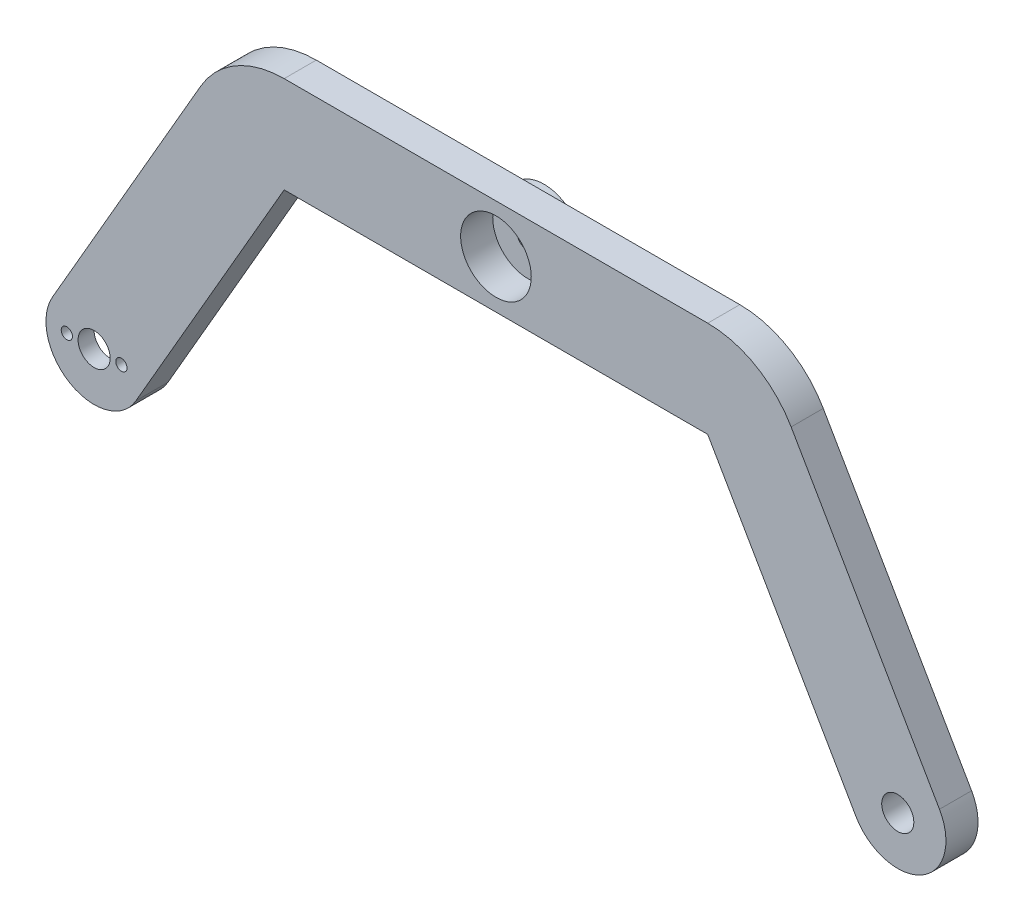
ISO-10303-21;
HEADER;
FILE_DESCRIPTION(('STEP AP214'),'2;1');
FILE_NAME('part.step','',(''),(''),'','','');
FILE_SCHEMA(('AUTOMOTIVE_DESIGN { 1 0 10303 214 1 1 1 1 }'));
ENDSEC;
DATA;
#1=APPLICATION_CONTEXT('core data for automotive mechanical design processes');
#2=APPLICATION_PROTOCOL_DEFINITION('international standard','automotive_design',2000,#1);
#3=PRODUCT_CONTEXT('',#1,'mechanical');
#4=PRODUCT('Part','Part','',(#3));
#5=PRODUCT_RELATED_PRODUCT_CATEGORY('part','',(#4));
#6=PRODUCT_DEFINITION_FORMATION('','',#4);
#7=PRODUCT_DEFINITION_CONTEXT('part definition',#1,'design');
#8=PRODUCT_DEFINITION('design','',#6,#7);
#9=PRODUCT_DEFINITION_SHAPE('','',#8);
#10=(LENGTH_UNIT() NAMED_UNIT(*) SI_UNIT(.MILLI.,.METRE.));
#11=(NAMED_UNIT(*) PLANE_ANGLE_UNIT() SI_UNIT($,.RADIAN.));
#12=(NAMED_UNIT(*) SI_UNIT($,.STERADIAN.) SOLID_ANGLE_UNIT());
#13=UNCERTAINTY_MEASURE_WITH_UNIT(LENGTH_MEASURE(1.E-05),#10,'distance_accuracy_value','');
#14=(GEOMETRIC_REPRESENTATION_CONTEXT(3) GLOBAL_UNCERTAINTY_ASSIGNED_CONTEXT((#13)) GLOBAL_UNIT_ASSIGNED_CONTEXT((#10,
#11,#12)) REPRESENTATION_CONTEXT('',''));
#15=CARTESIAN_POINT('',(0.,0.,0.));
#16=DIRECTION('',(0.,0.,1.));
#17=DIRECTION('',(1.,0.,0.));
#18=AXIS2_PLACEMENT_3D('',#15,#16,#17);
#19=CARTESIAN_POINT('',(-133.644870925994,-87.5182766758697,10.));
#20=DIRECTION('',(0.,0.,-1.));
#21=DIRECTION('',(-1.,0.,0.));
#22=AXIS2_PLACEMENT_3D('',#19,#20,#21);
#23=CYLINDRICAL_SURFACE('',#22,1.75000000000001);
#24=CARTESIAN_POINT('',(-133.644870925994,-87.5182766758697,10.));
#25=DIRECTION('',(0.,0.,1.));
#26=DIRECTION('',(1.,0.,0.));
#27=AXIS2_PLACEMENT_3D('',#24,#25,#26);
#28=CIRCLE('',#27,1.75000000000001);
#29=CARTESIAN_POINT('',(-131.894870925994,-87.5182766758697,10.));
#30=VERTEX_POINT('',#29);
#31=EDGE_CURVE('E156',#30,#30,#28,.T.);
#32=ORIENTED_EDGE('',*,*,#31,.T.);
#33=EDGE_LOOP('',(#32));
#34=FACE_BOUND('',#33,.T.);
#35=CARTESIAN_POINT('',(-133.644870925994,-87.5182766758697,5.));
#36=DIRECTION('',(0.,0.,-1.));
#37=DIRECTION('',(-1.,0.,0.));
#38=AXIS2_PLACEMENT_3D('',#35,#36,#37);
#39=CIRCLE('',#38,1.75000000000001);
#40=CARTESIAN_POINT('',(-135.394870925994,-87.5182766758697,5.));
#41=VERTEX_POINT('',#40);
#42=EDGE_CURVE('E243',#41,#41,#39,.T.);
#43=ORIENTED_EDGE('',*,*,#42,.T.);
#44=EDGE_LOOP('',(#43));
#45=FACE_BOUND('',#44,.T.);
#46=ADVANCED_FACE('F41',(#34,#45),#23,.F.);
#47=CARTESIAN_POINT('',(-116.644870925994,-87.5182766758697,10.));
#48=DIRECTION('',(0.,0.,-1.));
#49=DIRECTION('',(-1.,0.,0.));
#50=AXIS2_PLACEMENT_3D('',#47,#48,#49);
#51=CYLINDRICAL_SURFACE('',#50,1.75000000000004);
#52=CARTESIAN_POINT('',(-116.644870925994,-87.5182766758697,10.));
#53=DIRECTION('',(0.,0.,1.));
#54=DIRECTION('',(1.,0.,0.));
#55=AXIS2_PLACEMENT_3D('',#52,#53,#54);
#56=CIRCLE('',#55,1.75000000000004);
#57=CARTESIAN_POINT('',(-114.894870925994,-87.5182766758697,10.));
#58=VERTEX_POINT('',#57);
#59=EDGE_CURVE('E221',#58,#58,#56,.T.);
#60=ORIENTED_EDGE('',*,*,#59,.T.);
#61=EDGE_LOOP('',(#60));
#62=FACE_BOUND('',#61,.T.);
#63=CARTESIAN_POINT('',(-116.644870925994,-87.5182766758697,5.));
#64=DIRECTION('',(0.,0.,-1.));
#65=DIRECTION('',(-1.,0.,0.));
#66=AXIS2_PLACEMENT_3D('',#63,#64,#65);
#67=CIRCLE('',#66,1.75000000000004);
#68=CARTESIAN_POINT('',(-118.394870925994,-87.5182766758697,5.));
#69=VERTEX_POINT('',#68);
#70=EDGE_CURVE('E248',#69,#69,#67,.T.);
#71=ORIENTED_EDGE('',*,*,#70,.T.);
#72=EDGE_LOOP('',(#71));
#73=FACE_BOUND('',#72,.T.);
#74=ADVANCED_FACE('F295',(#62,#73),#51,.F.);
#75=CARTESIAN_POINT('',(-125.144870925994,-87.5182766758698,-31.1126983722081));
#76=DIRECTION('',(0.,0.,1.));
#77=DIRECTION('',(1.,0.,0.));
#78=AXIS2_PLACEMENT_3D('',#75,#76,#77);
#79=CYLINDRICAL_SURFACE('',#78,5.00000000000001);
#80=CARTESIAN_POINT('',(-125.144870925994,-87.5182766758698,10.));
#81=DIRECTION('',(0.,0.,1.));
#82=DIRECTION('',(1.,0.,0.));
#83=AXIS2_PLACEMENT_3D('',#80,#81,#82);
#84=CIRCLE('',#83,5.00000000000001);
#85=CARTESIAN_POINT('',(-120.144870925994,-87.5182766758698,10.));
#86=VERTEX_POINT('',#85);
#87=EDGE_CURVE('E228',#86,#86,#84,.T.);
#88=ORIENTED_EDGE('',*,*,#87,.T.);
#89=EDGE_LOOP('',(#88));
#90=FACE_BOUND('',#89,.T.);
#91=CARTESIAN_POINT('',(-125.144870925994,-87.5182766758698,5.));
#92=DIRECTION('',(0.,0.,-1.));
#93=DIRECTION('',(-1.,0.,0.));
#94=AXIS2_PLACEMENT_3D('',#91,#92,#93);
#95=CIRCLE('',#94,5.00000000000001);
#96=CARTESIAN_POINT('',(-130.144870925994,-87.5182766758698,5.));
#97=VERTEX_POINT('',#96);
#98=EDGE_CURVE('E45',#97,#97,#95,.F.);
#99=ORIENTED_EDGE('',*,*,#98,.F.);
#100=EDGE_LOOP('',(#99));
#101=FACE_BOUND('',#100,.T.);
#102=ADVANCED_FACE('F301',(#90,#101),#79,.F.);
#103=CARTESIAN_POINT('',(-65.9559162903233,-15.,10.));
#104=DIRECTION('',(0.,0.,-1.));
#105=DIRECTION('',(-1.,0.,0.));
#106=AXIS2_PLACEMENT_3D('',#103,#104,#105);
#107=PLANE('',#106);
#108=CARTESIAN_POINT('',(0.,0.,10.));
#109=DIRECTION('',(0.,0.,1.));
#110=DIRECTION('',(1.,0.,0.));
#111=AXIS2_PLACEMENT_3D('',#108,#109,#110);
#112=CIRCLE('',#111,11.);
#113=CARTESIAN_POINT('',(11.,0.,10.));
#114=VERTEX_POINT('',#113);
#115=EDGE_CURVE('E235',#114,#114,#112,.T.);
#116=ORIENTED_EDGE('',*,*,#115,.F.);
#117=EDGE_LOOP('',(#116));
#118=FACE_BOUND('',#117,.T.);
#119=ORIENTED_EDGE('',*,*,#87,.F.);
#120=EDGE_LOOP('',(#119));
#121=FACE_BOUND('',#120,.T.);
#122=CARTESIAN_POINT('',(125.144870925994,-87.5182766758698,10.));
#123=DIRECTION('',(0.,0.,1.));
#124=DIRECTION('',(1.,0.,0.));
#125=AXIS2_PLACEMENT_3D('',#122,#123,#124);
#126=CIRCLE('',#125,5.00000000000002);
#127=CARTESIAN_POINT('',(130.144870925994,-87.5182766758698,10.));
#128=VERTEX_POINT('',#127);
#129=EDGE_CURVE('E225',#128,#128,#126,.T.);
#130=ORIENTED_EDGE('',*,*,#129,.F.);
#131=EDGE_LOOP('',(#130));
#132=FACE_BOUND('',#131,.T.);
#133=CARTESIAN_POINT('',(-65.9559162903233,-15.,10.));
#134=DIRECTION('',(0.,0.,1.));
#135=DIRECTION('',(-1.,0.,0.));
#136=AXIS2_PLACEMENT_3D('',#133,#134,#135);
#137=CIRCLE('',#136,30.);
#138=CARTESIAN_POINT('',(-65.9559162903233,15.,10.));
#139=VERTEX_POINT('',#138);
#140=CARTESIAN_POINT('',(-91.9366784038564,1.1698415145435E-13,10.));
#141=VERTEX_POINT('',#140);
#142=EDGE_CURVE('E171',#139,#141,#137,.T.);
#143=ORIENTED_EDGE('',*,*,#142,.T.);
#144=DIRECTION('',(-0.500000000000004,-0.866025403784436,0.));
#145=VECTOR('',#144,1.);
#146=CARTESIAN_POINT('',(-138.13525198276,-80.0182766758697,10.));
#147=LINE('',#146,#145);
#148=CARTESIAN_POINT('',(-138.13525198276,-80.0182766758697,10.));
#149=VERTEX_POINT('',#148);
#150=EDGE_CURVE('E108',#141,#149,#147,.T.);
#151=ORIENTED_EDGE('',*,*,#150,.T.);
#152=CARTESIAN_POINT('',(-125.144870925994,-87.5182766758698,10.));
#153=DIRECTION('',(0.,0.,1.));
#154=DIRECTION('',(1.,0.,0.));
#155=AXIS2_PLACEMENT_3D('',#152,#153,#154);
#156=CIRCLE('',#155,15.);
#157=CARTESIAN_POINT('',(-112.154489869227,-95.0182766758698,10.));
#158=VERTEX_POINT('',#157);
#159=EDGE_CURVE('E193',#149,#158,#156,.T.);
#160=ORIENTED_EDGE('',*,*,#159,.T.);
#161=DIRECTION('',(0.500000000000004,0.866025403784436,0.));
#162=VECTOR('',#161,1.);
#163=CARTESIAN_POINT('',(-65.9559162903233,-15.,10.));
#164=LINE('',#163,#162);
#165=CARTESIAN_POINT('',(-65.9559162903233,-15.,10.));
#166=VERTEX_POINT('',#165);
#167=EDGE_CURVE('E211',#158,#166,#164,.T.);
#168=ORIENTED_EDGE('',*,*,#167,.T.);
#169=DIRECTION('',(1.,0.,0.));
#170=VECTOR('',#169,1.);
#171=CARTESIAN_POINT('',(65.9559162903233,-15.,10.));
#172=LINE('',#171,#170);
#173=CARTESIAN_POINT('',(65.9559162903233,-15.,10.));
#174=VERTEX_POINT('',#173);
#175=EDGE_CURVE('E208',#166,#174,#172,.T.);
#176=ORIENTED_EDGE('',*,*,#175,.T.);
#177=DIRECTION('',(0.500000000000004,-0.866025403784436,0.));
#178=VECTOR('',#177,1.);
#179=CARTESIAN_POINT('',(65.9559162903233,-15.,10.));
#180=LINE('',#179,#178);
#181=CARTESIAN_POINT('',(112.154489869227,-95.0182766758698,10.));
#182=VERTEX_POINT('',#181);
#183=EDGE_CURVE('E210',#174,#182,#180,.T.);
#184=ORIENTED_EDGE('',*,*,#183,.T.);
#185=CARTESIAN_POINT('',(125.144870925994,-87.5182766758698,10.));
#186=DIRECTION('',(0.,0.,1.));
#187=DIRECTION('',(1.,0.,0.));
#188=AXIS2_PLACEMENT_3D('',#185,#186,#187);
#189=CIRCLE('',#188,15.);
#190=CARTESIAN_POINT('',(138.13525198276,-80.0182766758697,10.));
#191=VERTEX_POINT('',#190);
#192=EDGE_CURVE('E134',#182,#191,#189,.T.);
#193=ORIENTED_EDGE('',*,*,#192,.T.);
#194=DIRECTION('',(-0.500000000000004,0.866025403784436,0.));
#195=VECTOR('',#194,1.);
#196=CARTESIAN_POINT('',(138.13525198276,-80.0182766758697,10.));
#197=LINE('',#196,#195);
#198=CARTESIAN_POINT('',(91.9366784038564,1.196959198424E-13,10.));
#199=VERTEX_POINT('',#198);
#200=EDGE_CURVE('E127',#191,#199,#197,.T.);
#201=ORIENTED_EDGE('',*,*,#200,.T.);
#202=CARTESIAN_POINT('',(65.9559162903233,-15.,10.));
#203=DIRECTION('',(0.,0.,1.));
#204=DIRECTION('',(1.,0.,0.));
#205=AXIS2_PLACEMENT_3D('',#202,#203,#204);
#206=CIRCLE('',#205,30.);
#207=CARTESIAN_POINT('',(65.9559162903233,15.,10.));
#208=VERTEX_POINT('',#207);
#209=EDGE_CURVE('E132',#199,#208,#206,.T.);
#210=ORIENTED_EDGE('',*,*,#209,.T.);
#211=DIRECTION('',(-1.,0.,0.));
#212=VECTOR('',#211,1.);
#213=CARTESIAN_POINT('',(65.9559162903233,15.,10.));
#214=LINE('',#213,#212);
#215=EDGE_CURVE('E59',#208,#139,#214,.T.);
#216=ORIENTED_EDGE('',*,*,#215,.T.);
#217=EDGE_LOOP('',(#143,#151,#160,#168,#176,#184,#193,#201,#210,#216));
#218=FACE_BOUND('',#217,.T.);
#219=ORIENTED_EDGE('',*,*,#31,.F.);
#220=EDGE_LOOP('',(#219));
#221=FACE_BOUND('',#220,.T.);
#222=ORIENTED_EDGE('',*,*,#59,.F.);
#223=EDGE_LOOP('',(#222));
#224=FACE_BOUND('',#223,.T.);
#225=ADVANCED_FACE('F129',(#118,#121,#132,#218,#221,#224),#107,.F.);
#226=CARTESIAN_POINT('',(-65.9559162903233,-15.,0.));
#227=DIRECTION('',(0.,0.,-1.));
#228=DIRECTION('',(-1.,0.,0.));
#229=AXIS2_PLACEMENT_3D('',#226,#227,#228);
#230=PLANE('',#229);
#231=CARTESIAN_POINT('',(-125.144870925994,-87.5182766758698,0.));
#232=DIRECTION('',(0.,0.,-1.));
#233=DIRECTION('',(-1.,0.,0.));
#234=AXIS2_PLACEMENT_3D('',#231,#232,#233);
#235=CIRCLE('',#234,13.);
#236=CARTESIAN_POINT('',(-138.144870925994,-87.5182766758698,0.));
#237=VERTEX_POINT('',#236);
#238=EDGE_CURVE('E254',#237,#237,#235,.T.);
#239=ORIENTED_EDGE('',*,*,#238,.F.);
#240=EDGE_LOOP('',(#239));
#241=FACE_BOUND('',#240,.T.);
#242=CARTESIAN_POINT('',(0.,0.,0.));
#243=DIRECTION('',(0.,0.,-1.));
#244=DIRECTION('',(-1.,0.,0.));
#245=AXIS2_PLACEMENT_3D('',#242,#243,#244);
#246=CIRCLE('',#245,12.);
#247=CARTESIAN_POINT('',(-12.,0.,0.));
#248=VERTEX_POINT('',#247);
#249=EDGE_CURVE('E240',#248,#248,#246,.T.);
#250=ORIENTED_EDGE('',*,*,#249,.F.);
#251=EDGE_LOOP('',(#250));
#252=FACE_BOUND('',#251,.T.);
#253=CARTESIAN_POINT('',(125.144870925994,-87.5182766758698,0.));
#254=DIRECTION('',(0.,0.,-1.));
#255=DIRECTION('',(-1.,0.,0.));
#256=AXIS2_PLACEMENT_3D('',#253,#254,#255);
#257=CIRCLE('',#256,5.00000000000002);
#258=CARTESIAN_POINT('',(120.144870925994,-87.5182766758698,0.));
#259=VERTEX_POINT('',#258);
#260=EDGE_CURVE('E229',#259,#259,#257,.F.);
#261=ORIENTED_EDGE('',*,*,#260,.T.);
#262=EDGE_LOOP('',(#261));
#263=FACE_BOUND('',#262,.T.);
#264=CARTESIAN_POINT('',(-65.9559162903233,-15.,0.));
#265=DIRECTION('',(0.,0.,1.));
#266=DIRECTION('',(-1.,0.,0.));
#267=AXIS2_PLACEMENT_3D('',#264,#265,#266);
#268=CIRCLE('',#267,30.);
#269=CARTESIAN_POINT('',(-65.9559162903233,15.,0.));
#270=VERTEX_POINT('',#269);
#271=CARTESIAN_POINT('',(-91.9366784038564,1.1698415145435E-13,0.));
#272=VERTEX_POINT('',#271);
#273=EDGE_CURVE('E152',#270,#272,#268,.T.);
#274=ORIENTED_EDGE('',*,*,#273,.F.);
#275=DIRECTION('',(-1.,0.,0.));
#276=VECTOR('',#275,1.);
#277=CARTESIAN_POINT('',(65.9559162903233,15.,0.));
#278=LINE('',#277,#276);
#279=CARTESIAN_POINT('',(65.9559162903233,15.,0.));
#280=VERTEX_POINT('',#279);
#281=EDGE_CURVE('E100',#280,#270,#278,.T.);
#282=ORIENTED_EDGE('',*,*,#281,.F.);
#283=CARTESIAN_POINT('',(65.9559162903233,-15.,0.));
#284=DIRECTION('',(0.,0.,1.));
#285=DIRECTION('',(1.,0.,0.));
#286=AXIS2_PLACEMENT_3D('',#283,#284,#285);
#287=CIRCLE('',#286,30.);
#288=CARTESIAN_POINT('',(91.9366784038564,1.196959198424E-13,0.));
#289=VERTEX_POINT('',#288);
#290=EDGE_CURVE('E94',#289,#280,#287,.T.);
#291=ORIENTED_EDGE('',*,*,#290,.F.);
#292=DIRECTION('',(-0.500000000000004,0.866025403784436,0.));
#293=VECTOR('',#292,1.);
#294=CARTESIAN_POINT('',(138.13525198276,-80.0182766758697,0.));
#295=LINE('',#294,#293);
#296=CARTESIAN_POINT('',(138.13525198276,-80.0182766758697,0.));
#297=VERTEX_POINT('',#296);
#298=EDGE_CURVE('E142',#297,#289,#295,.T.);
#299=ORIENTED_EDGE('',*,*,#298,.F.);
#300=CARTESIAN_POINT('',(125.144870925994,-87.5182766758698,0.));
#301=DIRECTION('',(0.,0.,1.));
#302=DIRECTION('',(1.,0.,0.));
#303=AXIS2_PLACEMENT_3D('',#300,#301,#302);
#304=CIRCLE('',#303,15.);
#305=CARTESIAN_POINT('',(112.154489869227,-95.0182766758698,0.));
#306=VERTEX_POINT('',#305);
#307=EDGE_CURVE('E166',#306,#297,#304,.T.);
#308=ORIENTED_EDGE('',*,*,#307,.F.);
#309=DIRECTION('',(0.500000000000004,-0.866025403784436,0.));
#310=VECTOR('',#309,1.);
#311=CARTESIAN_POINT('',(65.9559162903233,-15.,0.));
#312=LINE('',#311,#310);
#313=CARTESIAN_POINT('',(65.9559162903233,-15.,0.));
#314=VERTEX_POINT('',#313);
#315=EDGE_CURVE('E164',#314,#306,#312,.T.);
#316=ORIENTED_EDGE('',*,*,#315,.F.);
#317=DIRECTION('',(1.,0.,0.));
#318=VECTOR('',#317,1.);
#319=CARTESIAN_POINT('',(65.9559162903233,-15.,0.));
#320=LINE('',#319,#318);
#321=CARTESIAN_POINT('',(-65.9559162903233,-15.,0.));
#322=VERTEX_POINT('',#321);
#323=EDGE_CURVE('E162',#322,#314,#320,.T.);
#324=ORIENTED_EDGE('',*,*,#323,.F.);
#325=DIRECTION('',(0.500000000000004,0.866025403784436,0.));
#326=VECTOR('',#325,1.);
#327=CARTESIAN_POINT('',(-65.9559162903233,-15.,0.));
#328=LINE('',#327,#326);
#329=CARTESIAN_POINT('',(-112.154489869227,-95.0182766758698,0.));
#330=VERTEX_POINT('',#329);
#331=EDGE_CURVE('E160',#330,#322,#328,.T.);
#332=ORIENTED_EDGE('',*,*,#331,.F.);
#333=CARTESIAN_POINT('',(-125.144870925994,-87.5182766758698,0.));
#334=DIRECTION('',(0.,0.,1.));
#335=DIRECTION('',(1.,0.,0.));
#336=AXIS2_PLACEMENT_3D('',#333,#334,#335);
#337=CIRCLE('',#336,15.);
#338=CARTESIAN_POINT('',(-138.13525198276,-80.0182766758697,0.));
#339=VERTEX_POINT('',#338);
#340=EDGE_CURVE('E158',#339,#330,#337,.T.);
#341=ORIENTED_EDGE('',*,*,#340,.F.);
#342=DIRECTION('',(-0.500000000000004,-0.866025403784436,0.));
#343=VECTOR('',#342,1.);
#344=CARTESIAN_POINT('',(-138.13525198276,-80.0182766758697,0.));
#345=LINE('',#344,#343);
#346=EDGE_CURVE('E155',#272,#339,#345,.T.);
#347=ORIENTED_EDGE('',*,*,#346,.F.);
#348=EDGE_LOOP('',(#274,#282,#291,#299,#308,#316,#324,#332,#341,#347));
#349=FACE_BOUND('',#348,.T.);
#350=ADVANCED_FACE('F197',(#241,#252,#263,#349),#230,.T.);
#351=CARTESIAN_POINT('',(-65.9559162903233,-15.,10.));
#352=DIRECTION('',(0.,0.,-1.));
#353=DIRECTION('',(-1.,0.,0.));
#354=AXIS2_PLACEMENT_3D('',#351,#352,#353);
#355=CYLINDRICAL_SURFACE('',#354,30.);
#356=ORIENTED_EDGE('',*,*,#273,.T.);
#357=DIRECTION('',(0.,0.,-1.));
#358=VECTOR('',#357,1.);
#359=CARTESIAN_POINT('',(-91.9366784038564,1.1698415145435E-13,10.));
#360=LINE('',#359,#358);
#361=EDGE_CURVE('E12',#141,#272,#360,.T.);
#362=ORIENTED_EDGE('',*,*,#361,.F.);
#363=ORIENTED_EDGE('',*,*,#142,.F.);
#364=DIRECTION('',(0.,0.,-1.));
#365=VECTOR('',#364,1.);
#366=CARTESIAN_POINT('',(-65.9559162903233,15.,10.));
#367=LINE('',#366,#365);
#368=EDGE_CURVE('E148',#139,#270,#367,.T.);
#369=ORIENTED_EDGE('',*,*,#368,.T.);
#370=EDGE_LOOP('',(#356,#362,#363,#369));
#371=FACE_BOUND('',#370,.T.);
#372=ADVANCED_FACE('F43',(#371),#355,.T.);
#373=CARTESIAN_POINT('',(-138.13525198276,-80.0182766758697,10.));
#374=DIRECTION('',(0.866025403784436,-0.500000000000004,0.));
#375=DIRECTION('',(0.500000000000004,0.866025403784436,0.));
#376=AXIS2_PLACEMENT_3D('',#373,#374,#375);
#377=PLANE('',#376);
#378=ORIENTED_EDGE('',*,*,#346,.T.);
#379=DIRECTION('',(0.,0.,-1.));
#380=VECTOR('',#379,1.);
#381=CARTESIAN_POINT('',(-138.13525198276,-80.0182766758697,10.));
#382=LINE('',#381,#380);
#383=EDGE_CURVE('E51',#149,#339,#382,.T.);
#384=ORIENTED_EDGE('',*,*,#383,.F.);
#385=ORIENTED_EDGE('',*,*,#150,.F.);
#386=ORIENTED_EDGE('',*,*,#361,.T.);
#387=EDGE_LOOP('',(#378,#384,#385,#386));
#388=FACE_BOUND('',#387,.T.);
#389=ADVANCED_FACE('F331',(#388),#377,.F.);
#390=CARTESIAN_POINT('',(-125.144870925994,-87.5182766758698,10.));
#391=DIRECTION('',(0.,0.,-1.));
#392=DIRECTION('',(-1.,0.,0.));
#393=AXIS2_PLACEMENT_3D('',#390,#391,#392);
#394=CYLINDRICAL_SURFACE('',#393,15.);
#395=ORIENTED_EDGE('',*,*,#340,.T.);
#396=DIRECTION('',(0.,0.,-1.));
#397=VECTOR('',#396,1.);
#398=CARTESIAN_POINT('',(-112.154489869227,-95.0182766758698,10.));
#399=LINE('',#398,#397);
#400=EDGE_CURVE('E184',#158,#330,#399,.T.);
#401=ORIENTED_EDGE('',*,*,#400,.F.);
#402=ORIENTED_EDGE('',*,*,#159,.F.);
#403=ORIENTED_EDGE('',*,*,#383,.T.);
#404=EDGE_LOOP('',(#395,#401,#402,#403));
#405=FACE_BOUND('',#404,.T.);
#406=ADVANCED_FACE('F191',(#405),#394,.T.);
#407=CARTESIAN_POINT('',(-65.9559162903233,-15.,10.));
#408=DIRECTION('',(-0.866025403784437,0.500000000000004,0.));
#409=DIRECTION('',(-0.500000000000004,-0.866025403784437,0.));
#410=AXIS2_PLACEMENT_3D('',#407,#408,#409);
#411=PLANE('',#410);
#412=ORIENTED_EDGE('',*,*,#331,.T.);
#413=DIRECTION('',(0.,0.,-1.));
#414=VECTOR('',#413,1.);
#415=CARTESIAN_POINT('',(-65.9559162903233,-15.,10.));
#416=LINE('',#415,#414);
#417=EDGE_CURVE('E181',#166,#322,#416,.T.);
#418=ORIENTED_EDGE('',*,*,#417,.F.);
#419=ORIENTED_EDGE('',*,*,#167,.F.);
#420=ORIENTED_EDGE('',*,*,#400,.T.);
#421=EDGE_LOOP('',(#412,#418,#419,#420));
#422=FACE_BOUND('',#421,.T.);
#423=ADVANCED_FACE('F202',(#422),#411,.F.);
#424=CARTESIAN_POINT('',(65.9559162903233,-15.,10.));
#425=DIRECTION('',(0.,1.,0.));
#426=DIRECTION('',(0.,0.,1.));
#427=AXIS2_PLACEMENT_3D('',#424,#425,#426);
#428=PLANE('',#427);
#429=ORIENTED_EDGE('',*,*,#323,.T.);
#430=DIRECTION('',(0.,0.,-1.));
#431=VECTOR('',#430,1.);
#432=CARTESIAN_POINT('',(65.9559162903233,-15.,10.));
#433=LINE('',#432,#431);
#434=EDGE_CURVE('E178',#174,#314,#433,.T.);
#435=ORIENTED_EDGE('',*,*,#434,.F.);
#436=ORIENTED_EDGE('',*,*,#175,.F.);
#437=ORIENTED_EDGE('',*,*,#417,.T.);
#438=EDGE_LOOP('',(#429,#435,#436,#437));
#439=FACE_BOUND('',#438,.T.);
#440=ADVANCED_FACE('F206',(#439),#428,.F.);
#441=CARTESIAN_POINT('',(65.9559162903233,-15.,10.));
#442=DIRECTION('',(0.866025403784437,0.500000000000004,0.));
#443=DIRECTION('',(-0.500000000000004,0.866025403784437,0.));
#444=AXIS2_PLACEMENT_3D('',#441,#442,#443);
#445=PLANE('',#444);
#446=ORIENTED_EDGE('',*,*,#315,.T.);
#447=DIRECTION('',(0.,0.,-1.));
#448=VECTOR('',#447,1.);
#449=CARTESIAN_POINT('',(112.154489869227,-95.0182766758698,10.));
#450=LINE('',#449,#448);
#451=EDGE_CURVE('E175',#182,#306,#450,.T.);
#452=ORIENTED_EDGE('',*,*,#451,.F.);
#453=ORIENTED_EDGE('',*,*,#183,.F.);
#454=ORIENTED_EDGE('',*,*,#434,.T.);
#455=EDGE_LOOP('',(#446,#452,#453,#454));
#456=FACE_BOUND('',#455,.T.);
#457=ADVANCED_FACE('F321',(#456),#445,.F.);
#458=CARTESIAN_POINT('',(125.144870925994,-87.5182766758698,10.));
#459=DIRECTION('',(0.,0.,-1.));
#460=DIRECTION('',(-1.,0.,0.));
#461=AXIS2_PLACEMENT_3D('',#458,#459,#460);
#462=CYLINDRICAL_SURFACE('',#461,15.);
#463=ORIENTED_EDGE('',*,*,#307,.T.);
#464=DIRECTION('',(0.,0.,-1.));
#465=VECTOR('',#464,1.);
#466=CARTESIAN_POINT('',(138.13525198276,-80.0182766758697,10.));
#467=LINE('',#466,#465);
#468=EDGE_CURVE('E143',#191,#297,#467,.T.);
#469=ORIENTED_EDGE('',*,*,#468,.F.);
#470=ORIENTED_EDGE('',*,*,#192,.F.);
#471=ORIENTED_EDGE('',*,*,#451,.T.);
#472=EDGE_LOOP('',(#463,#469,#470,#471));
#473=FACE_BOUND('',#472,.T.);
#474=ADVANCED_FACE('F318',(#473),#462,.T.);
#475=CARTESIAN_POINT('',(138.13525198276,-80.0182766758697,10.));
#476=DIRECTION('',(-0.866025403784436,-0.500000000000004,0.));
#477=DIRECTION('',(0.500000000000004,-0.866025403784436,0.));
#478=AXIS2_PLACEMENT_3D('',#475,#476,#477);
#479=PLANE('',#478);
#480=ORIENTED_EDGE('',*,*,#298,.T.);
#481=DIRECTION('',(0.,0.,-1.));
#482=VECTOR('',#481,1.);
#483=CARTESIAN_POINT('',(91.9366784038564,1.196959198424E-13,10.));
#484=LINE('',#483,#482);
#485=EDGE_CURVE('E139',#199,#289,#484,.T.);
#486=ORIENTED_EDGE('',*,*,#485,.F.);
#487=ORIENTED_EDGE('',*,*,#200,.F.);
#488=ORIENTED_EDGE('',*,*,#468,.T.);
#489=EDGE_LOOP('',(#480,#486,#487,#488));
#490=FACE_BOUND('',#489,.T.);
#491=ADVANCED_FACE('F140',(#490),#479,.F.);
#492=CARTESIAN_POINT('',(65.9559162903233,-15.,10.));
#493=DIRECTION('',(0.,0.,-1.));
#494=DIRECTION('',(-1.,0.,0.));
#495=AXIS2_PLACEMENT_3D('',#492,#493,#494);
#496=CYLINDRICAL_SURFACE('',#495,30.);
#497=ORIENTED_EDGE('',*,*,#290,.T.);
#498=DIRECTION('',(0.,0.,-1.));
#499=VECTOR('',#498,1.);
#500=CARTESIAN_POINT('',(65.9559162903233,15.,10.));
#501=LINE('',#500,#499);
#502=EDGE_CURVE('E144',#208,#280,#501,.T.);
#503=ORIENTED_EDGE('',*,*,#502,.F.);
#504=ORIENTED_EDGE('',*,*,#209,.F.);
#505=ORIENTED_EDGE('',*,*,#485,.T.);
#506=EDGE_LOOP('',(#497,#503,#504,#505));
#507=FACE_BOUND('',#506,.T.);
#508=ADVANCED_FACE('F146',(#507),#496,.T.);
#509=CARTESIAN_POINT('',(65.9559162903233,15.,10.));
#510=DIRECTION('',(0.,-1.,0.));
#511=DIRECTION('',(0.,0.,-1.));
#512=AXIS2_PLACEMENT_3D('',#509,#510,#511);
#513=PLANE('',#512);
#514=ORIENTED_EDGE('',*,*,#281,.T.);
#515=ORIENTED_EDGE('',*,*,#368,.F.);
#516=ORIENTED_EDGE('',*,*,#215,.F.);
#517=ORIENTED_EDGE('',*,*,#502,.T.);
#518=EDGE_LOOP('',(#514,#515,#516,#517));
#519=FACE_BOUND('',#518,.T.);
#520=ADVANCED_FACE('F289',(#519),#513,.F.);
#521=CARTESIAN_POINT('',(125.144870925994,-87.5182766758698,-31.1126983722081));
#522=DIRECTION('',(0.,0.,1.));
#523=DIRECTION('',(1.,0.,0.));
#524=AXIS2_PLACEMENT_3D('',#521,#522,#523);
#525=CYLINDRICAL_SURFACE('',#524,5.00000000000002);
#526=ORIENTED_EDGE('',*,*,#129,.T.);
#527=EDGE_LOOP('',(#526));
#528=FACE_BOUND('',#527,.T.);
#529=ORIENTED_EDGE('',*,*,#260,.F.);
#530=EDGE_LOOP('',(#529));
#531=FACE_BOUND('',#530,.T.);
#532=ADVANCED_FACE('F283',(#528,#531),#525,.F.);
#533=CARTESIAN_POINT('',(0.,0.,-31.1126983722081));
#534=DIRECTION('',(0.,0.,1.));
#535=DIRECTION('',(1.,0.,0.));
#536=AXIS2_PLACEMENT_3D('',#533,#534,#535);
#537=CYLINDRICAL_SURFACE('',#536,11.);
#538=ORIENTED_EDGE('',*,*,#115,.T.);
#539=EDGE_LOOP('',(#538));
#540=FACE_BOUND('',#539,.T.);
#541=CARTESIAN_POINT('',(0.,0.,0.));
#542=DIRECTION('',(0.,0.,-1.));
#543=DIRECTION('',(-1.,0.,0.));
#544=AXIS2_PLACEMENT_3D('',#541,#542,#543);
#545=CIRCLE('',#544,11.);
#546=CARTESIAN_POINT('',(-11.,0.,0.));
#547=VERTEX_POINT('',#546);
#548=EDGE_CURVE('E224',#547,#547,#545,.F.);
#549=ORIENTED_EDGE('',*,*,#548,.F.);
#550=EDGE_LOOP('',(#549));
#551=FACE_BOUND('',#550,.T.);
#552=ADVANCED_FACE('F278',(#540,#551),#537,.F.);
#553=CARTESIAN_POINT('',(0.,0.,0.));
#554=DIRECTION('',(0.,0.,-1.));
#555=DIRECTION('',(-1.,0.,0.));
#556=AXIS2_PLACEMENT_3D('',#553,#554,#555);
#557=PLANE('',#556);
#558=CARTESIAN_POINT('',(0.,0.,0.));
#559=DIRECTION('',(0.,0.,-1.));
#560=DIRECTION('',(-1.,0.,0.));
#561=AXIS2_PLACEMENT_3D('',#558,#559,#560);
#562=CIRCLE('',#561,3.5);
#563=CARTESIAN_POINT('',(-3.5,0.,0.));
#564=VERTEX_POINT('',#563);
#565=EDGE_CURVE('E257',#564,#564,#562,.T.);
#566=ORIENTED_EDGE('',*,*,#565,.T.);
#567=EDGE_LOOP('',(#566));
#568=FACE_BOUND('',#567,.T.);
#569=ORIENTED_EDGE('',*,*,#548,.T.);
#570=EDGE_LOOP('',(#569));
#571=FACE_BOUND('',#570,.T.);
#572=ADVANCED_FACE('F274',(#568,#571),#557,.F.);
#573=CARTESIAN_POINT('',(0.,0.,-5.));
#574=DIRECTION('',(0.,0.,1.));
#575=DIRECTION('',(1.,0.,0.));
#576=AXIS2_PLACEMENT_3D('',#573,#574,#575);
#577=CYLINDRICAL_SURFACE('',#576,12.);
#578=CARTESIAN_POINT('',(0.,0.,-5.));
#579=DIRECTION('',(0.,0.,-1.));
#580=DIRECTION('',(-1.,0.,0.));
#581=AXIS2_PLACEMENT_3D('',#578,#579,#580);
#582=CIRCLE('',#581,12.);
#583=CARTESIAN_POINT('',(-12.,0.,-5.));
#584=VERTEX_POINT('',#583);
#585=EDGE_CURVE('E232',#584,#584,#582,.T.);
#586=ORIENTED_EDGE('',*,*,#585,.F.);
#587=EDGE_LOOP('',(#586));
#588=FACE_BOUND('',#587,.T.);
#589=ORIENTED_EDGE('',*,*,#249,.T.);
#590=EDGE_LOOP('',(#589));
#591=FACE_BOUND('',#590,.T.);
#592=ADVANCED_FACE('F277',(#588,#591),#577,.T.);
#593=CARTESIAN_POINT('',(0.,0.,-5.));
#594=DIRECTION('',(0.,0.,-1.));
#595=DIRECTION('',(-1.,0.,0.));
#596=AXIS2_PLACEMENT_3D('',#593,#594,#595);
#597=PLANE('',#596);
#598=CARTESIAN_POINT('',(0.,0.,-5.));
#599=DIRECTION('',(0.,0.,1.));
#600=DIRECTION('',(1.,0.,0.));
#601=AXIS2_PLACEMENT_3D('',#598,#599,#600);
#602=CIRCLE('',#601,3.5);
#603=CARTESIAN_POINT('',(3.5,0.,-5.));
#604=VERTEX_POINT('',#603);
#605=EDGE_CURVE('E260',#604,#604,#602,.T.);
#606=ORIENTED_EDGE('',*,*,#605,.T.);
#607=EDGE_LOOP('',(#606));
#608=FACE_BOUND('',#607,.T.);
#609=ORIENTED_EDGE('',*,*,#585,.T.);
#610=EDGE_LOOP('',(#609));
#611=FACE_BOUND('',#610,.T.);
#612=ADVANCED_FACE('F264',(#608,#611),#597,.T.);
#613=CARTESIAN_POINT('',(-65.9559162903233,-15.,5.));
#614=DIRECTION('',(0.,0.,-1.));
#615=DIRECTION('',(-1.,0.,0.));
#616=AXIS2_PLACEMENT_3D('',#613,#614,#615);
#617=PLANE('',#616);
#618=ORIENTED_EDGE('',*,*,#42,.F.);
#619=EDGE_LOOP('',(#618));
#620=FACE_BOUND('',#619,.T.);
#621=ORIENTED_EDGE('',*,*,#70,.F.);
#622=EDGE_LOOP('',(#621));
#623=FACE_BOUND('',#622,.T.);
#624=CARTESIAN_POINT('',(-125.144870925994,-87.5182766758698,5.));
#625=DIRECTION('',(0.,0.,-1.));
#626=DIRECTION('',(-1.,0.,0.));
#627=AXIS2_PLACEMENT_3D('',#624,#625,#626);
#628=CIRCLE('',#627,13.);
#629=CARTESIAN_POINT('',(-138.144870925994,-87.5182766758698,5.));
#630=VERTEX_POINT('',#629);
#631=EDGE_CURVE('E251',#630,#630,#628,.F.);
#632=ORIENTED_EDGE('',*,*,#631,.F.);
#633=EDGE_LOOP('',(#632));
#634=FACE_BOUND('',#633,.T.);
#635=ORIENTED_EDGE('',*,*,#98,.T.);
#636=EDGE_LOOP('',(#635));
#637=FACE_BOUND('',#636,.T.);
#638=ADVANCED_FACE('F487',(#620,#623,#634,#637),#617,.T.);
#639=CARTESIAN_POINT('',(-125.144870925994,-87.5182766758698,46.7695526217004));
#640=DIRECTION('',(0.,0.,-1.));
#641=DIRECTION('',(-1.,0.,0.));
#642=AXIS2_PLACEMENT_3D('',#639,#640,#641);
#643=CYLINDRICAL_SURFACE('',#642,13.);
#644=ORIENTED_EDGE('',*,*,#631,.T.);
#645=EDGE_LOOP('',(#644));
#646=FACE_BOUND('',#645,.T.);
#647=ORIENTED_EDGE('',*,*,#238,.T.);
#648=EDGE_LOOP('',(#647));
#649=FACE_BOUND('',#648,.T.);
#650=ADVANCED_FACE('F270',(#646,#649),#643,.F.);
#651=CARTESIAN_POINT('',(0.,0.,-5.));
#652=DIRECTION('',(0.,0.,1.));
#653=DIRECTION('',(1.,0.,0.));
#654=AXIS2_PLACEMENT_3D('',#651,#652,#653);
#655=CYLINDRICAL_SURFACE('',#654,3.5);
#656=ORIENTED_EDGE('',*,*,#605,.F.);
#657=EDGE_LOOP('',(#656));
#658=FACE_BOUND('',#657,.T.);
#659=ORIENTED_EDGE('',*,*,#565,.F.);
#660=EDGE_LOOP('',(#659));
#661=FACE_BOUND('',#660,.T.);
#662=ADVANCED_FACE('F267',(#658,#661),#655,.F.);
#663=CLOSED_SHELL('',(#46,#74,#102,#225,#350,#372,#389,#406,#423,#440,#457,#474,#491,#508,#520,
#532,#552,#572,#592,#612,#638,#650,#662));
#664=MANIFOLD_SOLID_BREP('B2',#663);
#665=ADVANCED_BREP_SHAPE_REPRESENTATION('',(#18,#664),#14);
#666=SHAPE_DEFINITION_REPRESENTATION(#9,#665);
ENDSEC;
END-ISO-10303-21;
